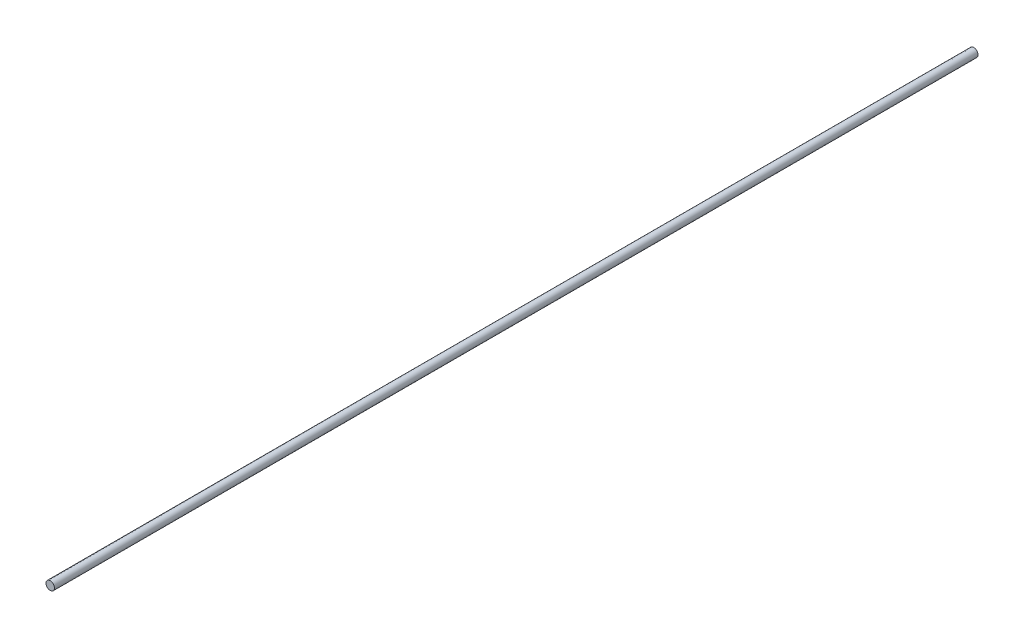
ISO-10303-21;
HEADER;
FILE_DESCRIPTION(('STEP AP214'),'2;1');
FILE_NAME('part.step','',(''),(''),'','','');
FILE_SCHEMA(('AUTOMOTIVE_DESIGN { 1 0 10303 214 1 1 1 1 }'));
ENDSEC;
DATA;
#1=APPLICATION_CONTEXT('core data for automotive mechanical design processes');
#2=APPLICATION_PROTOCOL_DEFINITION('international standard','automotive_design',2000,#1);
#3=PRODUCT_CONTEXT('',#1,'mechanical');
#4=PRODUCT('Part','Part','',(#3));
#5=PRODUCT_RELATED_PRODUCT_CATEGORY('part','',(#4));
#6=PRODUCT_DEFINITION_FORMATION('','',#4);
#7=PRODUCT_DEFINITION_CONTEXT('part definition',#1,'design');
#8=PRODUCT_DEFINITION('design','',#6,#7);
#9=PRODUCT_DEFINITION_SHAPE('','',#8);
#10=(LENGTH_UNIT() NAMED_UNIT(*) SI_UNIT(.MILLI.,.METRE.));
#11=(NAMED_UNIT(*) PLANE_ANGLE_UNIT() SI_UNIT($,.RADIAN.));
#12=(NAMED_UNIT(*) SI_UNIT($,.STERADIAN.) SOLID_ANGLE_UNIT());
#13=UNCERTAINTY_MEASURE_WITH_UNIT(LENGTH_MEASURE(1.E-05),#10,'distance_accuracy_value','');
#14=(GEOMETRIC_REPRESENTATION_CONTEXT(3) GLOBAL_UNCERTAINTY_ASSIGNED_CONTEXT((#13)) GLOBAL_UNIT_ASSIGNED_CONTEXT((#10,
#11,#12)) REPRESENTATION_CONTEXT('',''));
#15=CARTESIAN_POINT('',(0.,0.,0.));
#16=DIRECTION('',(0.,0.,1.));
#17=DIRECTION('',(1.,0.,0.));
#18=AXIS2_PLACEMENT_3D('',#15,#16,#17);
#19=CARTESIAN_POINT('',(0.,0.,327.));
#20=DIRECTION('',(0.,0.,-1.));
#21=DIRECTION('',(-1.,0.,0.));
#22=AXIS2_PLACEMENT_3D('',#19,#20,#21);
#23=CYLINDRICAL_SURFACE('',#22,1.5);
#24=CARTESIAN_POINT('',(0.,0.,327.));
#25=DIRECTION('',(0.,0.,1.));
#26=DIRECTION('',(1.,0.,0.));
#27=AXIS2_PLACEMENT_3D('',#24,#25,#26);
#28=CIRCLE('',#27,1.5);
#29=CARTESIAN_POINT('',(1.5,0.,327.));
#30=VERTEX_POINT('',#29);
#31=EDGE_CURVE('E10',#30,#30,#28,.T.);
#32=ORIENTED_EDGE('',*,*,#31,.F.);
#33=EDGE_LOOP('',(#32));
#34=FACE_BOUND('',#33,.T.);
#35=CARTESIAN_POINT('',(0.,0.,0.));
#36=DIRECTION('',(0.,0.,1.));
#37=DIRECTION('',(1.,0.,0.));
#38=AXIS2_PLACEMENT_3D('',#35,#36,#37);
#39=CIRCLE('',#38,1.5);
#40=CARTESIAN_POINT('',(1.5,0.,0.));
#41=VERTEX_POINT('',#40);
#42=EDGE_CURVE('E37',#41,#41,#39,.T.);
#43=ORIENTED_EDGE('',*,*,#42,.T.);
#44=EDGE_LOOP('',(#43));
#45=FACE_BOUND('',#44,.T.);
#46=ADVANCED_FACE('F40',(#34,#45),#23,.T.);
#47=CARTESIAN_POINT('',(0.,0.,327.));
#48=DIRECTION('',(0.,0.,1.));
#49=DIRECTION('',(1.,0.,0.));
#50=AXIS2_PLACEMENT_3D('',#47,#48,#49);
#51=PLANE('',#50);
#52=ORIENTED_EDGE('',*,*,#31,.T.);
#53=EDGE_LOOP('',(#52));
#54=FACE_BOUND('',#53,.T.);
#55=ADVANCED_FACE('F55',(#54),#51,.T.);
#56=CARTESIAN_POINT('',(0.,0.,0.));
#57=DIRECTION('',(0.,0.,1.));
#58=DIRECTION('',(1.,0.,0.));
#59=AXIS2_PLACEMENT_3D('',#56,#57,#58);
#60=PLANE('',#59);
#61=ORIENTED_EDGE('',*,*,#42,.F.);
#62=EDGE_LOOP('',(#61));
#63=FACE_BOUND('',#62,.T.);
#64=ADVANCED_FACE('F49',(#63),#60,.F.);
#65=CLOSED_SHELL('',(#46,#55,#64));
#66=MANIFOLD_SOLID_BREP('B2',#65);
#67=ADVANCED_BREP_SHAPE_REPRESENTATION('',(#18,#66),#14);
#68=SHAPE_DEFINITION_REPRESENTATION(#9,#67);
ENDSEC;
END-ISO-10303-21;
